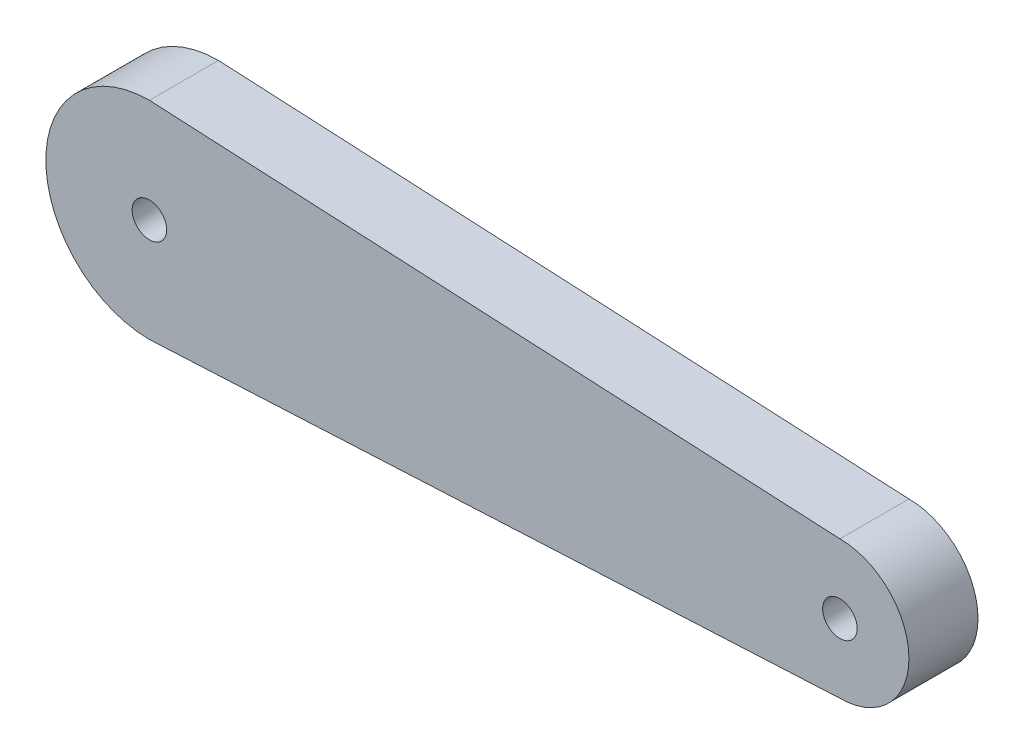
ISO-10303-21;
HEADER;
FILE_DESCRIPTION(('STEP AP214'),'2;1');
FILE_NAME('part.step','',(''),(''),'','','');
FILE_SCHEMA(('AUTOMOTIVE_DESIGN { 1 0 10303 214 1 1 1 1 }'));
ENDSEC;
DATA;
#1=APPLICATION_CONTEXT('core data for automotive mechanical design processes');
#2=APPLICATION_PROTOCOL_DEFINITION('international standard','automotive_design',2000,#1);
#3=PRODUCT_CONTEXT('',#1,'mechanical');
#4=PRODUCT('Part','Part','',(#3));
#5=PRODUCT_RELATED_PRODUCT_CATEGORY('part','',(#4));
#6=PRODUCT_DEFINITION_FORMATION('','',#4);
#7=PRODUCT_DEFINITION_CONTEXT('part definition',#1,'design');
#8=PRODUCT_DEFINITION('design','',#6,#7);
#9=PRODUCT_DEFINITION_SHAPE('','',#8);
#10=(LENGTH_UNIT() NAMED_UNIT(*) SI_UNIT(.MILLI.,.METRE.));
#11=(NAMED_UNIT(*) PLANE_ANGLE_UNIT() SI_UNIT($,.RADIAN.));
#12=(NAMED_UNIT(*) SI_UNIT($,.STERADIAN.) SOLID_ANGLE_UNIT());
#13=UNCERTAINTY_MEASURE_WITH_UNIT(LENGTH_MEASURE(1.E-05),#10,'distance_accuracy_value','');
#14=(GEOMETRIC_REPRESENTATION_CONTEXT(3) GLOBAL_UNCERTAINTY_ASSIGNED_CONTEXT((#13)) GLOBAL_UNIT_ASSIGNED_CONTEXT((#10,
#11,#12)) REPRESENTATION_CONTEXT('',''));
#15=CARTESIAN_POINT('',(0.,0.,0.));
#16=DIRECTION('',(0.,0.,1.));
#17=DIRECTION('',(1.,0.,0.));
#18=AXIS2_PLACEMENT_3D('',#15,#16,#17);
#19=CARTESIAN_POINT('',(0.612945165776507,12.2589033155302,10.));
#20=DIRECTION('',(0.049937616943892,0.998752338877845,0.));
#21=DIRECTION('',(-0.998752338877845,0.049937616943892,0.));
#22=AXIS2_PLACEMENT_3D('',#19,#20,#21);
#23=PLANE('',#22);
#24=DIRECTION('',(0.998752338877845,-0.049937616943892,0.));
#25=VECTOR('',#24,1.);
#26=CARTESIAN_POINT('',(0.612945165776507,12.2589033155302,0.));
#27=LINE('',#26,#25);
#28=CARTESIAN_POINT('',(-37.8453677220562,14.1818189599218,0.));
#29=VERTEX_POINT('',#28);
#30=CARTESIAN_POINT('',(62.1546322779438,9.18181895992186,0.));
#31=VERTEX_POINT('',#30);
#32=EDGE_CURVE('E97',#29,#31,#27,.T.);
#33=ORIENTED_EDGE('',*,*,#32,.F.);
#34=DIRECTION('',(0.,0.,-1.));
#35=VECTOR('',#34,1.);
#36=CARTESIAN_POINT('',(-37.8453677220562,14.1818189599218,10.));
#37=LINE('',#36,#35);
#38=CARTESIAN_POINT('',(-37.8453677220562,14.1818189599218,10.));
#39=VERTEX_POINT('',#38);
#40=EDGE_CURVE('E11',#39,#29,#37,.T.);
#41=ORIENTED_EDGE('',*,*,#40,.F.);
#42=DIRECTION('',(0.998752338877845,-0.049937616943892,0.));
#43=VECTOR('',#42,1.);
#44=CARTESIAN_POINT('',(0.612945165776507,12.2589033155302,10.));
#45=LINE('',#44,#43);
#46=CARTESIAN_POINT('',(62.1546322779438,9.18181895992186,10.));
#47=VERTEX_POINT('',#46);
#48=EDGE_CURVE('E85',#39,#47,#45,.T.);
#49=ORIENTED_EDGE('',*,*,#48,.T.);
#50=DIRECTION('',(0.,0.,-1.));
#51=VECTOR('',#50,1.);
#52=CARTESIAN_POINT('',(62.1546322779438,9.18181895992186,10.));
#53=LINE('',#52,#51);
#54=EDGE_CURVE('E74',#47,#31,#53,.T.);
#55=ORIENTED_EDGE('',*,*,#54,.T.);
#56=EDGE_LOOP('',(#33,#41,#49,#55));
#57=FACE_BOUND('',#56,.T.);
#58=ADVANCED_FACE('F35',(#57),#23,.T.);
#59=CARTESIAN_POINT('',(-37.8453677220562,-0.818181040078164,10.));
#60=DIRECTION('',(0.,0.,-1.));
#61=DIRECTION('',(-1.,0.,0.));
#62=AXIS2_PLACEMENT_3D('',#59,#60,#61);
#63=CYLINDRICAL_SURFACE('',#62,15.);
#64=CARTESIAN_POINT('',(-37.8453677220562,-0.818181040078164,0.));
#65=DIRECTION('',(0.,0.,1.));
#66=DIRECTION('',(1.,0.,0.));
#67=AXIS2_PLACEMENT_3D('',#64,#65,#66);
#68=CIRCLE('',#67,15.);
#69=CARTESIAN_POINT('',(-37.8453677220562,-15.8181810400782,0.));
#70=VERTEX_POINT('',#69);
#71=EDGE_CURVE('E90',#29,#70,#68,.T.);
#72=ORIENTED_EDGE('',*,*,#71,.T.);
#73=DIRECTION('',(0.,0.,-1.));
#74=VECTOR('',#73,1.);
#75=CARTESIAN_POINT('',(-37.8453677220562,-15.8181810400782,10.));
#76=LINE('',#75,#74);
#77=CARTESIAN_POINT('',(-37.8453677220562,-15.8181810400782,10.));
#78=VERTEX_POINT('',#77);
#79=EDGE_CURVE('E43',#78,#70,#76,.T.);
#80=ORIENTED_EDGE('',*,*,#79,.F.);
#81=CARTESIAN_POINT('',(-37.8453677220562,-0.818181040078164,10.));
#82=DIRECTION('',(0.,0.,1.));
#83=DIRECTION('',(1.,0.,0.));
#84=AXIS2_PLACEMENT_3D('',#81,#82,#83);
#85=CIRCLE('',#84,15.);
#86=EDGE_CURVE('E80',#39,#78,#85,.T.);
#87=ORIENTED_EDGE('',*,*,#86,.F.);
#88=ORIENTED_EDGE('',*,*,#40,.T.);
#89=EDGE_LOOP('',(#72,#80,#87,#88));
#90=FACE_BOUND('',#89,.T.);
#91=ADVANCED_FACE('F88',(#90),#63,.T.);
#92=CARTESIAN_POINT('',(0.69455923461224,-13.8911846922447,10.));
#93=DIRECTION('',(-0.0499376169438925,0.998752338877845,0.));
#94=DIRECTION('',(-0.998752338877845,-0.0499376169438925,0.));
#95=AXIS2_PLACEMENT_3D('',#92,#93,#94);
#96=PLANE('',#95);
#97=DIRECTION('',(0.998752338877845,0.0499376169438925,0.));
#98=VECTOR('',#97,1.);
#99=CARTESIAN_POINT('',(0.69455923461224,-13.8911846922447,0.));
#100=LINE('',#99,#98);
#101=CARTESIAN_POINT('',(62.1546322779438,-10.8181810400781,0.));
#102=VERTEX_POINT('',#101);
#103=EDGE_CURVE('E67',#70,#102,#100,.T.);
#104=ORIENTED_EDGE('',*,*,#103,.T.);
#105=DIRECTION('',(0.,0.,-1.));
#106=VECTOR('',#105,1.);
#107=CARTESIAN_POINT('',(62.1546322779438,-10.8181810400781,10.));
#108=LINE('',#107,#106);
#109=CARTESIAN_POINT('',(62.1546322779438,-10.8181810400781,10.));
#110=VERTEX_POINT('',#109);
#111=EDGE_CURVE('E91',#110,#102,#108,.T.);
#112=ORIENTED_EDGE('',*,*,#111,.F.);
#113=DIRECTION('',(0.998752338877845,0.0499376169438925,0.));
#114=VECTOR('',#113,1.);
#115=CARTESIAN_POINT('',(0.69455923461224,-13.8911846922447,10.));
#116=LINE('',#115,#114);
#117=EDGE_CURVE('E84',#78,#110,#116,.T.);
#118=ORIENTED_EDGE('',*,*,#117,.F.);
#119=ORIENTED_EDGE('',*,*,#79,.T.);
#120=EDGE_LOOP('',(#104,#112,#118,#119));
#121=FACE_BOUND('',#120,.T.);
#122=ADVANCED_FACE('F92',(#121),#96,.F.);
#123=CARTESIAN_POINT('',(62.1546322779438,-0.81818104007814,10.));
#124=DIRECTION('',(0.,0.,-1.));
#125=DIRECTION('',(-1.,0.,0.));
#126=AXIS2_PLACEMENT_3D('',#123,#124,#125);
#127=CYLINDRICAL_SURFACE('',#126,9.99999999999999);
#128=CARTESIAN_POINT('',(62.1546322779438,-0.81818104007814,0.));
#129=DIRECTION('',(0.,0.,1.));
#130=DIRECTION('',(1.,0.,0.));
#131=AXIS2_PLACEMENT_3D('',#128,#129,#130);
#132=CIRCLE('',#131,9.99999999999999);
#133=EDGE_CURVE('E103',#102,#31,#132,.T.);
#134=ORIENTED_EDGE('',*,*,#133,.T.);
#135=ORIENTED_EDGE('',*,*,#54,.F.);
#136=CARTESIAN_POINT('',(62.1546322779438,-0.81818104007814,10.));
#137=DIRECTION('',(0.,0.,1.));
#138=DIRECTION('',(1.,0.,0.));
#139=AXIS2_PLACEMENT_3D('',#136,#137,#138);
#140=CIRCLE('',#139,9.99999999999999);
#141=EDGE_CURVE('E51',#110,#47,#140,.T.);
#142=ORIENTED_EDGE('',*,*,#141,.F.);
#143=ORIENTED_EDGE('',*,*,#111,.T.);
#144=EDGE_LOOP('',(#134,#135,#142,#143));
#145=FACE_BOUND('',#144,.T.);
#146=ADVANCED_FACE('F108',(#145),#127,.T.);
#147=CARTESIAN_POINT('',(0.,0.,10.));
#148=DIRECTION('',(0.,0.,1.));
#149=DIRECTION('',(1.,0.,0.));
#150=AXIS2_PLACEMENT_3D('',#147,#148,#149);
#151=PLANE('',#150);
#152=CARTESIAN_POINT('',(-37.8453677220562,-0.818181040078164,10.));
#153=DIRECTION('',(0.,0.,1.));
#154=DIRECTION('',(1.,0.,0.));
#155=AXIS2_PLACEMENT_3D('',#152,#153,#154);
#156=CIRCLE('',#155,2.5);
#157=CARTESIAN_POINT('',(-35.3453677220562,-0.818181040078164,10.));
#158=VERTEX_POINT('',#157);
#159=EDGE_CURVE('E142',#158,#158,#156,.T.);
#160=ORIENTED_EDGE('',*,*,#159,.F.);
#161=EDGE_LOOP('',(#160));
#162=FACE_BOUND('',#161,.T.);
#163=CARTESIAN_POINT('',(62.1546322779438,-0.81818104007814,10.));
#164=DIRECTION('',(0.,0.,1.));
#165=DIRECTION('',(1.,0.,0.));
#166=AXIS2_PLACEMENT_3D('',#163,#164,#165);
#167=CIRCLE('',#166,2.5);
#168=CARTESIAN_POINT('',(64.6546322779438,-0.81818104007814,10.));
#169=VERTEX_POINT('',#168);
#170=EDGE_CURVE('E147',#169,#169,#167,.T.);
#171=ORIENTED_EDGE('',*,*,#170,.F.);
#172=EDGE_LOOP('',(#171));
#173=FACE_BOUND('',#172,.T.);
#174=ORIENTED_EDGE('',*,*,#48,.F.);
#175=ORIENTED_EDGE('',*,*,#86,.T.);
#176=ORIENTED_EDGE('',*,*,#117,.T.);
#177=ORIENTED_EDGE('',*,*,#141,.T.);
#178=EDGE_LOOP('',(#174,#175,#176,#177));
#179=FACE_BOUND('',#178,.T.);
#180=ADVANCED_FACE('F82',(#162,#173,#179),#151,.T.);
#181=CARTESIAN_POINT('',(0.,0.,0.));
#182=DIRECTION('',(0.,0.,1.));
#183=DIRECTION('',(1.,0.,0.));
#184=AXIS2_PLACEMENT_3D('',#181,#182,#183);
#185=PLANE('',#184);
#186=CARTESIAN_POINT('',(-37.8453677220562,-0.818181040078164,0.));
#187=DIRECTION('',(0.,0.,1.));
#188=DIRECTION('',(1.,0.,0.));
#189=AXIS2_PLACEMENT_3D('',#186,#187,#188);
#190=CIRCLE('',#189,2.5);
#191=CARTESIAN_POINT('',(-35.3453677220562,-0.818181040078164,0.));
#192=VERTEX_POINT('',#191);
#193=EDGE_CURVE('E100',#192,#192,#190,.T.);
#194=ORIENTED_EDGE('',*,*,#193,.T.);
#195=EDGE_LOOP('',(#194));
#196=FACE_BOUND('',#195,.T.);
#197=CARTESIAN_POINT('',(62.1546322779438,-0.81818104007814,0.));
#198=DIRECTION('',(0.,0.,1.));
#199=DIRECTION('',(1.,0.,0.));
#200=AXIS2_PLACEMENT_3D('',#197,#198,#199);
#201=CIRCLE('',#200,2.5);
#202=CARTESIAN_POINT('',(64.6546322779438,-0.81818104007814,0.));
#203=VERTEX_POINT('',#202);
#204=EDGE_CURVE('E143',#203,#203,#201,.T.);
#205=ORIENTED_EDGE('',*,*,#204,.T.);
#206=EDGE_LOOP('',(#205));
#207=FACE_BOUND('',#206,.T.);
#208=ORIENTED_EDGE('',*,*,#32,.T.);
#209=ORIENTED_EDGE('',*,*,#133,.F.);
#210=ORIENTED_EDGE('',*,*,#103,.F.);
#211=ORIENTED_EDGE('',*,*,#71,.F.);
#212=EDGE_LOOP('',(#208,#209,#210,#211));
#213=FACE_BOUND('',#212,.T.);
#214=ADVANCED_FACE('F110',(#196,#207,#213),#185,.F.);
#215=CARTESIAN_POINT('',(62.1546322779438,-0.81818104007814,0.));
#216=DIRECTION('',(0.,0.,1.));
#217=DIRECTION('',(1.,0.,0.));
#218=AXIS2_PLACEMENT_3D('',#215,#216,#217);
#219=CYLINDRICAL_SURFACE('',#218,2.5);
#220=ORIENTED_EDGE('',*,*,#204,.F.);
#221=EDGE_LOOP('',(#220));
#222=FACE_BOUND('',#221,.T.);
#223=ORIENTED_EDGE('',*,*,#170,.T.);
#224=EDGE_LOOP('',(#223));
#225=FACE_BOUND('',#224,.T.);
#226=ADVANCED_FACE('F124',(#222,#225),#219,.F.);
#227=CARTESIAN_POINT('',(-37.8453677220562,-0.818181040078164,0.));
#228=DIRECTION('',(0.,0.,1.));
#229=DIRECTION('',(1.,0.,0.));
#230=AXIS2_PLACEMENT_3D('',#227,#228,#229);
#231=CYLINDRICAL_SURFACE('',#230,2.5);
#232=ORIENTED_EDGE('',*,*,#193,.F.);
#233=EDGE_LOOP('',(#232));
#234=FACE_BOUND('',#233,.T.);
#235=ORIENTED_EDGE('',*,*,#159,.T.);
#236=EDGE_LOOP('',(#235));
#237=FACE_BOUND('',#236,.T.);
#238=ADVANCED_FACE('F131',(#234,#237),#231,.F.);
#239=CLOSED_SHELL('',(#58,#91,#122,#146,#180,#214,#226,#238));
#240=MANIFOLD_SOLID_BREP('B2',#239);
#241=ADVANCED_BREP_SHAPE_REPRESENTATION('',(#18,#240),#14);
#242=SHAPE_DEFINITION_REPRESENTATION(#9,#241);
ENDSEC;
END-ISO-10303-21;
